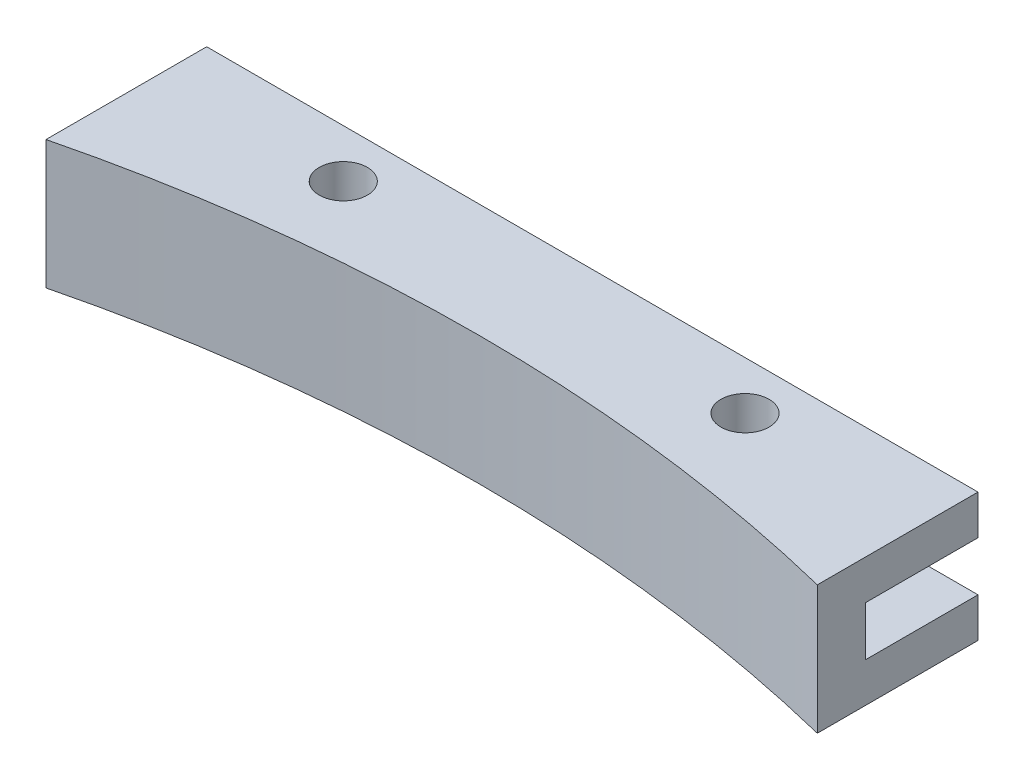
ISO-10303-21;
HEADER;
FILE_DESCRIPTION(('STEP AP214'),'2;1');
FILE_NAME('part.step','',(''),(''),'','','');
FILE_SCHEMA(('AUTOMOTIVE_DESIGN { 1 0 10303 214 1 1 1 1 }'));
ENDSEC;
DATA;
#1=APPLICATION_CONTEXT('core data for automotive mechanical design processes');
#2=APPLICATION_PROTOCOL_DEFINITION('international standard','automotive_design',2000,#1);
#3=PRODUCT_CONTEXT('',#1,'mechanical');
#4=PRODUCT('Part','Part','',(#3));
#5=PRODUCT_RELATED_PRODUCT_CATEGORY('part','',(#4));
#6=PRODUCT_DEFINITION_FORMATION('','',#4);
#7=PRODUCT_DEFINITION_CONTEXT('part definition',#1,'design');
#8=PRODUCT_DEFINITION('design','',#6,#7);
#9=PRODUCT_DEFINITION_SHAPE('','',#8);
#10=(LENGTH_UNIT() NAMED_UNIT(*) SI_UNIT(.MILLI.,.METRE.));
#11=(NAMED_UNIT(*) PLANE_ANGLE_UNIT() SI_UNIT($,.RADIAN.));
#12=(NAMED_UNIT(*) SI_UNIT($,.STERADIAN.) SOLID_ANGLE_UNIT());
#13=UNCERTAINTY_MEASURE_WITH_UNIT(LENGTH_MEASURE(1.E-05),#10,'distance_accuracy_value','');
#14=(GEOMETRIC_REPRESENTATION_CONTEXT(3) GLOBAL_UNCERTAINTY_ASSIGNED_CONTEXT((#13)) GLOBAL_UNIT_ASSIGNED_CONTEXT((#10,
#11,#12)) REPRESENTATION_CONTEXT('',''));
#15=CARTESIAN_POINT('',(0.,0.,0.));
#16=DIRECTION('',(0.,0.,1.));
#17=DIRECTION('',(1.,0.,0.));
#18=AXIS2_PLACEMENT_3D('',#15,#16,#17);
#19=CARTESIAN_POINT('',(-12.5,-4.,9.9227112039072));
#20=DIRECTION('',(0.,1.,0.));
#21=DIRECTION('',(0.,0.,1.));
#22=AXIS2_PLACEMENT_3D('',#19,#20,#21);
#23=CYLINDRICAL_SURFACE('',#22,1.5);
#24=CARTESIAN_POINT('',(-12.5,1.5375,9.9227112039072));
#25=DIRECTION('',(0.,1.,0.));
#26=DIRECTION('',(0.,0.,1.));
#27=AXIS2_PLACEMENT_3D('',#24,#25,#26);
#28=CIRCLE('',#27,1.5);
#29=CARTESIAN_POINT('',(-12.5,1.5375,11.4227112039072));
#30=VERTEX_POINT('',#29);
#31=EDGE_CURVE('E152',#30,#30,#28,.F.);
#32=ORIENTED_EDGE('',*,*,#31,.T.);
#33=EDGE_LOOP('',(#32));
#34=FACE_BOUND('',#33,.T.);
#35=CARTESIAN_POINT('',(-12.5,4.,9.9227112039072));
#36=DIRECTION('',(0.,1.,0.));
#37=DIRECTION('',(0.,0.,1.));
#38=AXIS2_PLACEMENT_3D('',#35,#36,#37);
#39=CIRCLE('',#38,1.5);
#40=CARTESIAN_POINT('',(-12.5,4.,11.4227112039072));
#41=VERTEX_POINT('',#40);
#42=EDGE_CURVE('E122',#41,#41,#39,.T.);
#43=ORIENTED_EDGE('',*,*,#42,.T.);
#44=EDGE_LOOP('',(#43));
#45=FACE_BOUND('',#44,.T.);
#46=ADVANCED_FACE('F45',(#34,#45),#23,.F.);
#47=CARTESIAN_POINT('',(12.5,-4.,9.9227112039072));
#48=DIRECTION('',(0.,1.,0.));
#49=DIRECTION('',(0.,0.,1.));
#50=AXIS2_PLACEMENT_3D('',#47,#48,#49);
#51=CYLINDRICAL_SURFACE('',#50,1.5);
#52=CARTESIAN_POINT('',(12.5,1.5375,9.9227112039072));
#53=DIRECTION('',(0.,1.,0.));
#54=DIRECTION('',(0.,0.,1.));
#55=AXIS2_PLACEMENT_3D('',#52,#53,#54);
#56=CIRCLE('',#55,1.5);
#57=CARTESIAN_POINT('',(12.5,1.5375,11.4227112039072));
#58=VERTEX_POINT('',#57);
#59=EDGE_CURVE('E156',#58,#58,#56,.F.);
#60=ORIENTED_EDGE('',*,*,#59,.T.);
#61=EDGE_LOOP('',(#60));
#62=FACE_BOUND('',#61,.T.);
#63=CARTESIAN_POINT('',(12.5,4.,9.9227112039072));
#64=DIRECTION('',(0.,1.,0.));
#65=DIRECTION('',(0.,0.,1.));
#66=AXIS2_PLACEMENT_3D('',#63,#64,#65);
#67=CIRCLE('',#66,1.5);
#68=CARTESIAN_POINT('',(12.5,4.,11.4227112039072));
#69=VERTEX_POINT('',#68);
#70=EDGE_CURVE('E137',#69,#69,#67,.T.);
#71=ORIENTED_EDGE('',*,*,#70,.T.);
#72=EDGE_LOOP('',(#71));
#73=FACE_BOUND('',#72,.T.);
#74=ADVANCED_FACE('F260',(#62,#73),#51,.F.);
#75=CARTESIAN_POINT('',(0.,-4.,6.9227112039072));
#76=DIRECTION('',(0.,0.,1.));
#77=DIRECTION('',(1.,0.,0.));
#78=AXIS2_PLACEMENT_3D('',#75,#76,#77);
#79=PLANE('',#78);
#80=DIRECTION('',(0.,1.,0.));
#81=VECTOR('',#80,1.);
#82=CARTESIAN_POINT('',(24.,-52.0120875525131,6.9227112039072));
#83=LINE('',#82,#81);
#84=CARTESIAN_POINT('',(24.,1.5375,6.9227112039072));
#85=VERTEX_POINT('',#84);
#86=CARTESIAN_POINT('',(24.,4.,6.9227112039072));
#87=VERTEX_POINT('',#86);
#88=EDGE_CURVE('E148',#85,#87,#83,.T.);
#89=ORIENTED_EDGE('',*,*,#88,.F.);
#90=DIRECTION('',(-1.,0.,0.));
#91=VECTOR('',#90,1.);
#92=CARTESIAN_POINT('',(24.,1.5375,6.9227112039072));
#93=LINE('',#92,#91);
#94=CARTESIAN_POINT('',(-24.,1.5375,6.9227112039072));
#95=VERTEX_POINT('',#94);
#96=EDGE_CURVE('E168',#85,#95,#93,.T.);
#97=ORIENTED_EDGE('',*,*,#96,.T.);
#98=DIRECTION('',(0.,1.,0.));
#99=VECTOR('',#98,1.);
#100=CARTESIAN_POINT('',(-24.,-52.0120875525131,6.9227112039072));
#101=LINE('',#100,#99);
#102=CARTESIAN_POINT('',(-24.,4.,6.9227112039072));
#103=VERTEX_POINT('',#102);
#104=EDGE_CURVE('E147',#95,#103,#101,.T.);
#105=ORIENTED_EDGE('',*,*,#104,.T.);
#106=DIRECTION('',(1.,0.,0.));
#107=VECTOR('',#106,1.);
#108=CARTESIAN_POINT('',(0.,4.,6.9227112039072));
#109=LINE('',#108,#107);
#110=EDGE_CURVE('E130',#103,#87,#109,.T.);
#111=ORIENTED_EDGE('',*,*,#110,.T.);
#112=EDGE_LOOP('',(#89,#97,#105,#111));
#113=FACE_BOUND('',#112,.T.);
#114=ADVANCED_FACE('F265',(#113),#79,.F.);
#115=CARTESIAN_POINT('',(-24.,4.,8.));
#116=DIRECTION('',(1.,0.,0.));
#117=DIRECTION('',(0.,0.,-1.));
#118=AXIS2_PLACEMENT_3D('',#115,#116,#117);
#119=PLANE('',#118);
#120=ORIENTED_EDGE('',*,*,#104,.F.);
#121=DIRECTION('',(0.,0.,-1.));
#122=VECTOR('',#121,1.);
#123=CARTESIAN_POINT('',(-24.,1.5375,6.9227112039072));
#124=LINE('',#123,#122);
#125=CARTESIAN_POINT('',(-24.,1.5375,13.9227112039072));
#126=VERTEX_POINT('',#125);
#127=EDGE_CURVE('E184',#126,#95,#124,.T.);
#128=ORIENTED_EDGE('',*,*,#127,.F.);
#129=DIRECTION('',(0.,1.,0.));
#130=VECTOR('',#129,1.);
#131=CARTESIAN_POINT('',(-24.,-1.5375,13.9227112039072));
#132=LINE('',#131,#130);
#133=CARTESIAN_POINT('',(-24.,-1.5375,13.9227112039072));
#134=VERTEX_POINT('',#133);
#135=EDGE_CURVE('E188',#134,#126,#132,.T.);
#136=ORIENTED_EDGE('',*,*,#135,.F.);
#137=DIRECTION('',(0.,0.,1.));
#138=VECTOR('',#137,1.);
#139=CARTESIAN_POINT('',(-24.,-1.5375,6.9227112039072));
#140=LINE('',#139,#138);
#141=CARTESIAN_POINT('',(-24.,-1.5375,6.9227112039072));
#142=VERTEX_POINT('',#141);
#143=EDGE_CURVE('E192',#142,#134,#140,.T.);
#144=ORIENTED_EDGE('',*,*,#143,.F.);
#145=CARTESIAN_POINT('',(-24.,-4.,6.9227112039072));
#146=VERTEX_POINT('',#145);
#147=EDGE_CURVE('E134',#146,#142,#101,.T.);
#148=ORIENTED_EDGE('',*,*,#147,.F.);
#149=DIRECTION('',(0.,0.,1.));
#150=VECTOR('',#149,1.);
#151=CARTESIAN_POINT('',(-24.,-4.,8.));
#152=LINE('',#151,#150);
#153=CARTESIAN_POINT('',(-24.,-4.,16.9227112039072));
#154=VERTEX_POINT('',#153);
#155=EDGE_CURVE('E92',#146,#154,#152,.T.);
#156=ORIENTED_EDGE('',*,*,#155,.T.);
#157=DIRECTION('',(0.,-1.,0.));
#158=VECTOR('',#157,1.);
#159=CARTESIAN_POINT('',(-24.,4.,16.9227112039072));
#160=LINE('',#159,#158);
#161=CARTESIAN_POINT('',(-24.,4.,16.9227112039072));
#162=VERTEX_POINT('',#161);
#163=EDGE_CURVE('E11',#162,#154,#160,.T.);
#164=ORIENTED_EDGE('',*,*,#163,.F.);
#165=DIRECTION('',(0.,0.,1.));
#166=VECTOR('',#165,1.);
#167=CARTESIAN_POINT('',(-24.,4.,8.));
#168=LINE('',#167,#166);
#169=EDGE_CURVE('E110',#103,#162,#168,.T.);
#170=ORIENTED_EDGE('',*,*,#169,.F.);
#171=EDGE_LOOP('',(#120,#128,#136,#144,#148,#156,#164,#170));
#172=FACE_BOUND('',#171,.T.);
#173=ADVANCED_FACE('F47',(#172),#119,.F.);
#174=CARTESIAN_POINT('',(0.,4.,114.));
#175=DIRECTION('',(0.,-1.,0.));
#176=DIRECTION('',(0.,0.,-1.));
#177=AXIS2_PLACEMENT_3D('',#174,#175,#176);
#178=CYLINDRICAL_SURFACE('',#177,100.);
#179=CARTESIAN_POINT('',(0.,-4.,114.));
#180=DIRECTION('',(0.,-1.,0.));
#181=DIRECTION('',(0.,0.,-1.));
#182=AXIS2_PLACEMENT_3D('',#179,#180,#181);
#183=CIRCLE('',#182,100.);
#184=CARTESIAN_POINT('',(24.,-4.,16.9227112039072));
#185=VERTEX_POINT('',#184);
#186=EDGE_CURVE('E82',#154,#185,#183,.T.);
#187=ORIENTED_EDGE('',*,*,#186,.T.);
#188=DIRECTION('',(0.,-1.,0.));
#189=VECTOR('',#188,1.);
#190=CARTESIAN_POINT('',(24.,4.,16.9227112039072));
#191=LINE('',#190,#189);
#192=CARTESIAN_POINT('',(24.,4.,16.9227112039072));
#193=VERTEX_POINT('',#192);
#194=EDGE_CURVE('E54',#193,#185,#191,.T.);
#195=ORIENTED_EDGE('',*,*,#194,.F.);
#196=CARTESIAN_POINT('',(0.,4.,114.));
#197=DIRECTION('',(0.,-1.,0.));
#198=DIRECTION('',(0.,0.,-1.));
#199=AXIS2_PLACEMENT_3D('',#196,#197,#198);
#200=CIRCLE('',#199,100.);
#201=EDGE_CURVE('E70',#162,#193,#200,.T.);
#202=ORIENTED_EDGE('',*,*,#201,.F.);
#203=ORIENTED_EDGE('',*,*,#163,.T.);
#204=EDGE_LOOP('',(#187,#195,#202,#203));
#205=FACE_BOUND('',#204,.T.);
#206=ADVANCED_FACE('F84',(#205),#178,.F.);
#207=CARTESIAN_POINT('',(24.,4.,8.));
#208=DIRECTION('',(-1.,0.,0.));
#209=DIRECTION('',(0.,0.,1.));
#210=AXIS2_PLACEMENT_3D('',#207,#208,#209);
#211=PLANE('',#210);
#212=DIRECTION('',(0.,1.,0.));
#213=VECTOR('',#212,1.);
#214=CARTESIAN_POINT('',(24.,-1.5375,13.9227112039072));
#215=LINE('',#214,#213);
#216=CARTESIAN_POINT('',(24.,-1.5375,13.9227112039072));
#217=VERTEX_POINT('',#216);
#218=CARTESIAN_POINT('',(24.,1.5375,13.9227112039072));
#219=VERTEX_POINT('',#218);
#220=EDGE_CURVE('E199',#217,#219,#215,.T.);
#221=ORIENTED_EDGE('',*,*,#220,.T.);
#222=DIRECTION('',(0.,0.,-1.));
#223=VECTOR('',#222,1.);
#224=CARTESIAN_POINT('',(24.,1.5375,6.9227112039072));
#225=LINE('',#224,#223);
#226=EDGE_CURVE('E173',#219,#85,#225,.T.);
#227=ORIENTED_EDGE('',*,*,#226,.T.);
#228=ORIENTED_EDGE('',*,*,#88,.T.);
#229=DIRECTION('',(0.,0.,-1.));
#230=VECTOR('',#229,1.);
#231=CARTESIAN_POINT('',(24.,4.,8.));
#232=LINE('',#231,#230);
#233=EDGE_CURVE('E102',#193,#87,#232,.T.);
#234=ORIENTED_EDGE('',*,*,#233,.F.);
#235=ORIENTED_EDGE('',*,*,#194,.T.);
#236=DIRECTION('',(0.,0.,-1.));
#237=VECTOR('',#236,1.);
#238=CARTESIAN_POINT('',(24.,-4.,8.));
#239=LINE('',#238,#237);
#240=CARTESIAN_POINT('',(24.,-4.,6.9227112039072));
#241=VERTEX_POINT('',#240);
#242=EDGE_CURVE('E91',#185,#241,#239,.T.);
#243=ORIENTED_EDGE('',*,*,#242,.T.);
#244=CARTESIAN_POINT('',(24.,-1.5375,6.9227112039072));
#245=VERTEX_POINT('',#244);
#246=EDGE_CURVE('E144',#241,#245,#83,.T.);
#247=ORIENTED_EDGE('',*,*,#246,.T.);
#248=DIRECTION('',(0.,0.,1.));
#249=VECTOR('',#248,1.);
#250=CARTESIAN_POINT('',(24.,-1.5375,6.9227112039072));
#251=LINE('',#250,#249);
#252=EDGE_CURVE('E61',#245,#217,#251,.T.);
#253=ORIENTED_EDGE('',*,*,#252,.T.);
#254=EDGE_LOOP('',(#221,#227,#228,#234,#235,#243,#247,#253));
#255=FACE_BOUND('',#254,.T.);
#256=ADVANCED_FACE('F97',(#255),#211,.F.);
#257=CARTESIAN_POINT('',(0.,4.,114.));
#258=DIRECTION('',(0.,-1.,0.));
#259=DIRECTION('',(0.,0.,-1.));
#260=AXIS2_PLACEMENT_3D('',#257,#258,#259);
#261=PLANE('',#260);
#262=ORIENTED_EDGE('',*,*,#233,.T.);
#263=ORIENTED_EDGE('',*,*,#110,.F.);
#264=ORIENTED_EDGE('',*,*,#169,.T.);
#265=ORIENTED_EDGE('',*,*,#201,.T.);
#266=EDGE_LOOP('',(#262,#263,#264,#265));
#267=FACE_BOUND('',#266,.T.);
#268=ORIENTED_EDGE('',*,*,#70,.F.);
#269=EDGE_LOOP('',(#268));
#270=FACE_BOUND('',#269,.T.);
#271=ORIENTED_EDGE('',*,*,#42,.F.);
#272=EDGE_LOOP('',(#271));
#273=FACE_BOUND('',#272,.T.);
#274=ADVANCED_FACE('F251',(#267,#270,#273),#261,.F.);
#275=CARTESIAN_POINT('',(0.,-4.,114.));
#276=DIRECTION('',(0.,-1.,0.));
#277=DIRECTION('',(0.,0.,-1.));
#278=AXIS2_PLACEMENT_3D('',#275,#276,#277);
#279=PLANE('',#278);
#280=DIRECTION('',(1.,0.,0.));
#281=VECTOR('',#280,1.);
#282=CARTESIAN_POINT('',(0.,-4.,6.9227112039072));
#283=LINE('',#282,#281);
#284=EDGE_CURVE('E107',#146,#241,#283,.T.);
#285=ORIENTED_EDGE('',*,*,#284,.T.);
#286=ORIENTED_EDGE('',*,*,#242,.F.);
#287=ORIENTED_EDGE('',*,*,#186,.F.);
#288=ORIENTED_EDGE('',*,*,#155,.F.);
#289=EDGE_LOOP('',(#285,#286,#287,#288));
#290=FACE_BOUND('',#289,.T.);
#291=CARTESIAN_POINT('',(12.5,-4.,9.9227112039072));
#292=DIRECTION('',(0.,1.,0.));
#293=DIRECTION('',(0.,0.,1.));
#294=AXIS2_PLACEMENT_3D('',#291,#292,#293);
#295=CIRCLE('',#294,1.5);
#296=CARTESIAN_POINT('',(12.5,-4.,11.4227112039072));
#297=VERTEX_POINT('',#296);
#298=EDGE_CURVE('E126',#297,#297,#295,.T.);
#299=ORIENTED_EDGE('',*,*,#298,.T.);
#300=EDGE_LOOP('',(#299));
#301=FACE_BOUND('',#300,.T.);
#302=CARTESIAN_POINT('',(-12.5,-4.,9.9227112039072));
#303=DIRECTION('',(0.,1.,0.));
#304=DIRECTION('',(0.,0.,1.));
#305=AXIS2_PLACEMENT_3D('',#302,#303,#304);
#306=CIRCLE('',#305,1.5);
#307=CARTESIAN_POINT('',(-12.5,-4.,11.4227112039072));
#308=VERTEX_POINT('',#307);
#309=EDGE_CURVE('E117',#308,#308,#306,.T.);
#310=ORIENTED_EDGE('',*,*,#309,.T.);
#311=EDGE_LOOP('',(#310));
#312=FACE_BOUND('',#311,.T.);
#313=ADVANCED_FACE('F104',(#290,#301,#312),#279,.T.);
#314=CARTESIAN_POINT('',(-12.5,-1.5375,9.9227112039072));
#315=DIRECTION('',(0.,-1.,0.));
#316=DIRECTION('',(0.,0.,-1.));
#317=AXIS2_PLACEMENT_3D('',#314,#315,#316);
#318=CIRCLE('',#317,1.5);
#319=CARTESIAN_POINT('',(-12.5,-1.5375,8.42271120390721));
#320=VERTEX_POINT('',#319);
#321=EDGE_CURVE('E160',#320,#320,#318,.F.);
#322=ORIENTED_EDGE('',*,*,#321,.T.);
#323=EDGE_LOOP('',(#322));
#324=FACE_BOUND('',#323,.T.);
#325=ORIENTED_EDGE('',*,*,#309,.F.);
#326=EDGE_LOOP('',(#325));
#327=FACE_BOUND('',#326,.T.);
#328=ADVANCED_FACE('F243',(#324,#327),#23,.F.);
#329=CARTESIAN_POINT('',(12.5,-1.5375,9.9227112039072));
#330=DIRECTION('',(0.,-1.,0.));
#331=DIRECTION('',(0.,0.,-1.));
#332=AXIS2_PLACEMENT_3D('',#329,#330,#331);
#333=CIRCLE('',#332,1.5);
#334=CARTESIAN_POINT('',(12.5,-1.5375,8.4227112039072));
#335=VERTEX_POINT('',#334);
#336=EDGE_CURVE('E164',#335,#335,#333,.F.);
#337=ORIENTED_EDGE('',*,*,#336,.T.);
#338=EDGE_LOOP('',(#337));
#339=FACE_BOUND('',#338,.T.);
#340=ORIENTED_EDGE('',*,*,#298,.F.);
#341=EDGE_LOOP('',(#340));
#342=FACE_BOUND('',#341,.T.);
#343=ADVANCED_FACE('F246',(#339,#342),#51,.F.);
#344=ORIENTED_EDGE('',*,*,#147,.T.);
#345=DIRECTION('',(-1.,0.,0.));
#346=VECTOR('',#345,1.);
#347=CARTESIAN_POINT('',(24.,-1.5375,6.9227112039072));
#348=LINE('',#347,#346);
#349=EDGE_CURVE('E169',#245,#142,#348,.T.);
#350=ORIENTED_EDGE('',*,*,#349,.F.);
#351=ORIENTED_EDGE('',*,*,#246,.F.);
#352=ORIENTED_EDGE('',*,*,#284,.F.);
#353=EDGE_LOOP('',(#344,#350,#351,#352));
#354=FACE_BOUND('',#353,.T.);
#355=ADVANCED_FACE('F229',(#354),#79,.F.);
#356=CARTESIAN_POINT('',(24.,1.5375,6.9227112039072));
#357=DIRECTION('',(0.,1.,0.));
#358=DIRECTION('',(0.,0.,1.));
#359=AXIS2_PLACEMENT_3D('',#356,#357,#358);
#360=PLANE('',#359);
#361=ORIENTED_EDGE('',*,*,#59,.F.);
#362=EDGE_LOOP('',(#361));
#363=FACE_BOUND('',#362,.T.);
#364=ORIENTED_EDGE('',*,*,#127,.T.);
#365=ORIENTED_EDGE('',*,*,#96,.F.);
#366=ORIENTED_EDGE('',*,*,#226,.F.);
#367=DIRECTION('',(-1.,0.,0.));
#368=VECTOR('',#367,1.);
#369=CARTESIAN_POINT('',(24.,1.5375,13.9227112039072));
#370=LINE('',#369,#368);
#371=EDGE_CURVE('E177',#219,#126,#370,.T.);
#372=ORIENTED_EDGE('',*,*,#371,.T.);
#373=EDGE_LOOP('',(#364,#365,#366,#372));
#374=FACE_BOUND('',#373,.T.);
#375=ORIENTED_EDGE('',*,*,#31,.F.);
#376=EDGE_LOOP('',(#375));
#377=FACE_BOUND('',#376,.T.);
#378=ADVANCED_FACE('F238',(#363,#374,#377),#360,.F.);
#379=CARTESIAN_POINT('',(24.,-1.5375,6.9227112039072));
#380=DIRECTION('',(0.,-1.,0.));
#381=DIRECTION('',(0.,0.,-1.));
#382=AXIS2_PLACEMENT_3D('',#379,#380,#381);
#383=PLANE('',#382);
#384=ORIENTED_EDGE('',*,*,#336,.F.);
#385=EDGE_LOOP('',(#384));
#386=FACE_BOUND('',#385,.T.);
#387=ORIENTED_EDGE('',*,*,#143,.T.);
#388=DIRECTION('',(-1.,0.,0.));
#389=VECTOR('',#388,1.);
#390=CARTESIAN_POINT('',(24.,-1.5375,13.9227112039072));
#391=LINE('',#390,#389);
#392=EDGE_CURVE('E172',#217,#134,#391,.T.);
#393=ORIENTED_EDGE('',*,*,#392,.F.);
#394=ORIENTED_EDGE('',*,*,#252,.F.);
#395=ORIENTED_EDGE('',*,*,#349,.T.);
#396=EDGE_LOOP('',(#387,#393,#394,#395));
#397=FACE_BOUND('',#396,.T.);
#398=ORIENTED_EDGE('',*,*,#321,.F.);
#399=EDGE_LOOP('',(#398));
#400=FACE_BOUND('',#399,.T.);
#401=ADVANCED_FACE('F234',(#386,#397,#400),#383,.F.);
#402=CARTESIAN_POINT('',(24.,-1.5375,13.9227112039072));
#403=DIRECTION('',(0.,0.,1.));
#404=DIRECTION('',(1.,0.,0.));
#405=AXIS2_PLACEMENT_3D('',#402,#403,#404);
#406=PLANE('',#405);
#407=ORIENTED_EDGE('',*,*,#135,.T.);
#408=ORIENTED_EDGE('',*,*,#371,.F.);
#409=ORIENTED_EDGE('',*,*,#220,.F.);
#410=ORIENTED_EDGE('',*,*,#392,.T.);
#411=EDGE_LOOP('',(#407,#408,#409,#410));
#412=FACE_BOUND('',#411,.T.);
#413=ADVANCED_FACE('F237',(#412),#406,.F.);
#414=CLOSED_SHELL('',(#46,#74,#114,#173,#206,#256,#274,#313,#328,#343,#355,#378,#401,#413));
#415=MANIFOLD_SOLID_BREP('B2',#414);
#416=ADVANCED_BREP_SHAPE_REPRESENTATION('',(#18,#415),#14);
#417=SHAPE_DEFINITION_REPRESENTATION(#9,#416);
ENDSEC;
END-ISO-10303-21;
